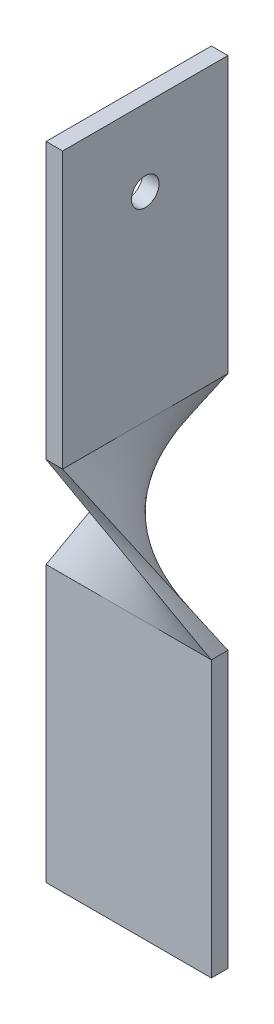
ISO-10303-21;
HEADER;
FILE_DESCRIPTION(('STEP AP214'),'2;1');
FILE_NAME('part.step','',(''),(''),'','','');
FILE_SCHEMA(('AUTOMOTIVE_DESIGN { 1 0 10303 214 1 1 1 1 }'));
ENDSEC;
DATA;
#1=APPLICATION_CONTEXT('core data for automotive mechanical design processes');
#2=APPLICATION_PROTOCOL_DEFINITION('international standard','automotive_design',2000,#1);
#3=PRODUCT_CONTEXT('',#1,'mechanical');
#4=PRODUCT('Part','Part','',(#3));
#5=PRODUCT_RELATED_PRODUCT_CATEGORY('part','',(#4));
#6=PRODUCT_DEFINITION_FORMATION('','',#4);
#7=PRODUCT_DEFINITION_CONTEXT('part definition',#1,'design');
#8=PRODUCT_DEFINITION('design','',#6,#7);
#9=PRODUCT_DEFINITION_SHAPE('','',#8);
#10=(LENGTH_UNIT() NAMED_UNIT(*) SI_UNIT(.MILLI.,.METRE.));
#11=(NAMED_UNIT(*) PLANE_ANGLE_UNIT() SI_UNIT($,.RADIAN.));
#12=(NAMED_UNIT(*) SI_UNIT($,.STERADIAN.) SOLID_ANGLE_UNIT());
#13=UNCERTAINTY_MEASURE_WITH_UNIT(LENGTH_MEASURE(1.E-05),#10,'distance_accuracy_value','');
#14=(GEOMETRIC_REPRESENTATION_CONTEXT(3) GLOBAL_UNCERTAINTY_ASSIGNED_CONTEXT((#13)) GLOBAL_UNIT_ASSIGNED_CONTEXT((#10,
#11,#12)) REPRESENTATION_CONTEXT('',''));
#15=CARTESIAN_POINT('',(0.,0.,0.));
#16=DIRECTION('',(0.,0.,1.));
#17=DIRECTION('',(1.,0.,0.));
#18=AXIS2_PLACEMENT_3D('',#15,#16,#17);
#19=CARTESIAN_POINT('',(0.,50.,0.));
#20=DIRECTION('',(1.,0.,0.));
#21=DIRECTION('',(0.,0.,-1.));
#22=AXIS2_PLACEMENT_3D('',#19,#20,#21);
#23=PLANE('',#22);
#24=DIRECTION('',(0.,0.,1.));
#25=VECTOR('',#24,1.);
#26=CARTESIAN_POINT('',(0.,0.,0.));
#27=LINE('',#26,#25);
#28=CARTESIAN_POINT('',(0.,0.,-3.));
#29=VERTEX_POINT('',#28);
#30=CARTESIAN_POINT('',(0.,0.,0.));
#31=VERTEX_POINT('',#30);
#32=EDGE_CURVE('E241',#29,#31,#27,.T.);
#33=ORIENTED_EDGE('',*,*,#32,.T.);
#34=DIRECTION('',(0.,-1.,0.));
#35=VECTOR('',#34,1.);
#36=CARTESIAN_POINT('',(0.,50.,0.));
#37=LINE('',#36,#35);
#38=CARTESIAN_POINT('',(0.,50.,0.));
#39=VERTEX_POINT('',#38);
#40=EDGE_CURVE('E12',#39,#31,#37,.T.);
#41=ORIENTED_EDGE('',*,*,#40,.F.);
#42=DIRECTION('',(0.,0.,-1.));
#43=VECTOR('',#42,1.);
#44=CARTESIAN_POINT('',(0.,50.,0.));
#45=LINE('',#44,#43);
#46=CARTESIAN_POINT('',(0.,50.,-3.));
#47=VERTEX_POINT('',#46);
#48=EDGE_CURVE('E311',#47,#39,#45,.F.);
#49=ORIENTED_EDGE('',*,*,#48,.F.);
#50=DIRECTION('',(0.,-1.,0.));
#51=VECTOR('',#50,1.);
#52=CARTESIAN_POINT('',(0.,50.,-3.));
#53=LINE('',#52,#51);
#54=EDGE_CURVE('E314',#47,#29,#53,.T.);
#55=ORIENTED_EDGE('',*,*,#54,.T.);
#56=EDGE_LOOP('',(#33,#41,#49,#55));
#57=FACE_BOUND('',#56,.T.);
#58=ADVANCED_FACE('F43',(#57),#23,.F.);
#59=CARTESIAN_POINT('',(0.,50.,0.));
#60=DIRECTION('',(0.,0.,-1.));
#61=DIRECTION('',(-1.,0.,0.));
#62=AXIS2_PLACEMENT_3D('',#59,#60,#61);
#63=PLANE('',#62);
#64=DIRECTION('',(1.,0.,0.));
#65=VECTOR('',#64,1.);
#66=CARTESIAN_POINT('',(0.,0.,0.));
#67=LINE('',#66,#65);
#68=CARTESIAN_POINT('',(30.,0.,0.));
#69=VERTEX_POINT('',#68);
#70=EDGE_CURVE('E300',#31,#69,#67,.T.);
#71=ORIENTED_EDGE('',*,*,#70,.T.);
#72=DIRECTION('',(0.,-1.,0.));
#73=VECTOR('',#72,1.);
#74=CARTESIAN_POINT('',(30.,50.,0.));
#75=LINE('',#74,#73);
#76=CARTESIAN_POINT('',(30.,50.,0.));
#77=VERTEX_POINT('',#76);
#78=EDGE_CURVE('E52',#77,#69,#75,.T.);
#79=ORIENTED_EDGE('',*,*,#78,.F.);
#80=DIRECTION('',(-1.,0.,0.));
#81=VECTOR('',#80,1.);
#82=CARTESIAN_POINT('',(0.,50.,0.));
#83=LINE('',#82,#81);
#84=EDGE_CURVE('E71',#39,#77,#83,.F.);
#85=ORIENTED_EDGE('',*,*,#84,.F.);
#86=ORIENTED_EDGE('',*,*,#40,.T.);
#87=EDGE_LOOP('',(#71,#79,#85,#86));
#88=FACE_BOUND('',#87,.T.);
#89=ADVANCED_FACE('F294',(#88),#63,.F.);
#90=CARTESIAN_POINT('',(30.,50.,0.));
#91=DIRECTION('',(-1.,0.,0.));
#92=DIRECTION('',(0.,0.,1.));
#93=AXIS2_PLACEMENT_3D('',#90,#91,#92);
#94=PLANE('',#93);
#95=DIRECTION('',(0.,0.,-1.));
#96=VECTOR('',#95,1.);
#97=CARTESIAN_POINT('',(30.,0.,0.));
#98=LINE('',#97,#96);
#99=CARTESIAN_POINT('',(30.,0.,-3.));
#100=VERTEX_POINT('',#99);
#101=EDGE_CURVE('E305',#69,#100,#98,.T.);
#102=ORIENTED_EDGE('',*,*,#101,.T.);
#103=DIRECTION('',(0.,-1.,0.));
#104=VECTOR('',#103,1.);
#105=CARTESIAN_POINT('',(30.,50.,-3.));
#106=LINE('',#105,#104);
#107=CARTESIAN_POINT('',(30.,50.,-3.));
#108=VERTEX_POINT('',#107);
#109=EDGE_CURVE('E60',#108,#100,#106,.T.);
#110=ORIENTED_EDGE('',*,*,#109,.F.);
#111=DIRECTION('',(0.,0.,1.));
#112=VECTOR('',#111,1.);
#113=CARTESIAN_POINT('',(30.,50.,0.));
#114=LINE('',#113,#112);
#115=EDGE_CURVE('E308',#77,#108,#114,.F.);
#116=ORIENTED_EDGE('',*,*,#115,.F.);
#117=ORIENTED_EDGE('',*,*,#78,.T.);
#118=EDGE_LOOP('',(#102,#110,#116,#117));
#119=FACE_BOUND('',#118,.T.);
#120=ADVANCED_FACE('F292',(#119),#94,.F.);
#121=CARTESIAN_POINT('',(0.,50.,-3.));
#122=DIRECTION('',(0.,0.,1.));
#123=DIRECTION('',(1.,0.,0.));
#124=AXIS2_PLACEMENT_3D('',#121,#122,#123);
#125=PLANE('',#124);
#126=DIRECTION('',(-1.,0.,0.));
#127=VECTOR('',#126,1.);
#128=CARTESIAN_POINT('',(0.,0.,-3.));
#129=LINE('',#128,#127);
#130=EDGE_CURVE('E78',#100,#29,#129,.T.);
#131=ORIENTED_EDGE('',*,*,#130,.T.);
#132=ORIENTED_EDGE('',*,*,#54,.F.);
#133=DIRECTION('',(1.,0.,0.));
#134=VECTOR('',#133,1.);
#135=CARTESIAN_POINT('',(0.,50.,-3.));
#136=LINE('',#135,#134);
#137=EDGE_CURVE('E316',#108,#47,#136,.F.);
#138=ORIENTED_EDGE('',*,*,#137,.F.);
#139=ORIENTED_EDGE('',*,*,#109,.T.);
#140=EDGE_LOOP('',(#131,#132,#138,#139));
#141=FACE_BOUND('',#140,.T.);
#142=ADVANCED_FACE('F288',(#141),#125,.F.);
#143=CARTESIAN_POINT('',(0.,0.,0.));
#144=DIRECTION('',(0.,-1.,0.));
#145=DIRECTION('',(0.,0.,-1.));
#146=AXIS2_PLACEMENT_3D('',#143,#144,#145);
#147=PLANE('',#146);
#148=ORIENTED_EDGE('',*,*,#32,.F.);
#149=ORIENTED_EDGE('',*,*,#130,.F.);
#150=ORIENTED_EDGE('',*,*,#101,.F.);
#151=ORIENTED_EDGE('',*,*,#70,.F.);
#152=EDGE_LOOP('',(#148,#149,#150,#151));
#153=FACE_BOUND('',#152,.T.);
#154=ADVANCED_FACE('F178',(#153),#147,.T.);
#155=CARTESIAN_POINT('',(0.,50.,-3.));
#156=CARTESIAN_POINT('',(16.5,80.,-16.5));
#157=CARTESIAN_POINT('',(0.,50.,-2.5));
#158=CARTESIAN_POINT('',(16.,80.,-16.5));
#159=CARTESIAN_POINT('',(0.,50.,-2.));
#160=CARTESIAN_POINT('',(15.5,80.,-16.5));
#161=CARTESIAN_POINT('',(0.,50.,-0.999999999999999));
#162=CARTESIAN_POINT('',(14.5,80.,-16.5));
#163=CARTESIAN_POINT('',(0.,50.,-0.5));
#164=CARTESIAN_POINT('',(14.,80.,-16.5));
#165=CARTESIAN_POINT('',(0.,50.,0.));
#166=CARTESIAN_POINT('',(13.5,80.,-16.5));
#167=B_SPLINE_SURFACE_WITH_KNOTS('',3,1,((#155,#156),(#157,#158),(#159,#160),(#161,#162),(#163,
#164),(#165,#166)),.UNSPECIFIED.,.F.,.F.,.F.,(4,2,4),(2,2),(0.,0.5,1.),(0.,1.),.UNSPECIFIED.);
#168=DIRECTION('',(0.36681261567265,0.815139145939222,-0.448326530266572));
#169=VECTOR('',#168,1.);
#170=CARTESIAN_POINT('',(6.75,65.,-8.25));
#171=LINE('',#170,#169);
#172=CARTESIAN_POINT('',(13.5,80.,-16.5));
#173=VERTEX_POINT('',#172);
#174=EDGE_CURVE('E143',#39,#173,#171,.T.);
#175=DIRECTION('',(-1.,0.,0.));
#176=VECTOR('',#175,1.);
#177=CARTESIAN_POINT('',(13.5,80.,-16.5));
#178=LINE('',#177,#176);
#179=CARTESIAN_POINT('',(16.5,80.,-16.5));
#180=VERTEX_POINT('',#179);
#181=EDGE_CURVE('E222',#180,#173,#178,.T.);
#182=DIRECTION('',(-0.448326530266572,-0.815139145939222,0.36681261567265));
#183=VECTOR('',#182,1.);
#184=CARTESIAN_POINT('',(8.25,65.,-9.75));
#185=LINE('',#184,#183);
#186=EDGE_CURVE('E140',#180,#47,#185,.T.);
#187=ORIENTED_EDGE('',*,*,#48,.T.);
#188=ORIENTED_EDGE('',*,*,#174,.T.);
#189=ORIENTED_EDGE('',*,*,#181,.F.);
#190=ORIENTED_EDGE('',*,*,#186,.T.);
#191=EDGE_LOOP('',(#187,#188,#189,#190));
#192=FACE_BOUND('',#191,.T.);
#193=ADVANCED_FACE('F171',(#192),#167,.T.);
#194=CARTESIAN_POINT('',(0.,50.,0.));
#195=CARTESIAN_POINT('',(13.5,80.,-16.5));
#196=CARTESIAN_POINT('',(5.,50.,0.));
#197=CARTESIAN_POINT('',(13.5,80.,-11.5));
#198=CARTESIAN_POINT('',(10.,50.,0.));
#199=CARTESIAN_POINT('',(13.5,80.,-6.50000000000002));
#200=CARTESIAN_POINT('',(20.,50.,0.));
#201=CARTESIAN_POINT('',(13.5,80.,3.49999999999998));
#202=CARTESIAN_POINT('',(25.,50.,0.));
#203=CARTESIAN_POINT('',(13.5,80.,8.49999999999999));
#204=CARTESIAN_POINT('',(30.,50.,0.));
#205=CARTESIAN_POINT('',(13.5,80.,13.5));
#206=B_SPLINE_SURFACE_WITH_KNOTS('',3,1,((#194,#195),(#196,#197),(#198,#199),(#200,#201),(#202,
#203),(#204,#205)),.UNSPECIFIED.,.F.,.F.,.F.,(4,2,4),(2,2),(0.,0.5,1.),(0.,1.),.UNSPECIFIED.);
#207=DIRECTION('',(-0.448326530266572,0.815139145939222,0.36681261567265));
#208=VECTOR('',#207,1.);
#209=CARTESIAN_POINT('',(21.75,65.,6.75));
#210=LINE('',#209,#208);
#211=CARTESIAN_POINT('',(13.5,80.,13.5));
#212=VERTEX_POINT('',#211);
#213=EDGE_CURVE('E252',#77,#212,#210,.T.);
#214=DIRECTION('',(0.,0.,1.));
#215=VECTOR('',#214,1.);
#216=CARTESIAN_POINT('',(13.5,80.,-16.5));
#217=LINE('',#216,#215);
#218=EDGE_CURVE('E138',#173,#212,#217,.T.);
#219=ORIENTED_EDGE('',*,*,#84,.T.);
#220=ORIENTED_EDGE('',*,*,#213,.T.);
#221=ORIENTED_EDGE('',*,*,#218,.F.);
#222=ORIENTED_EDGE('',*,*,#174,.F.);
#223=EDGE_LOOP('',(#219,#220,#221,#222));
#224=FACE_BOUND('',#223,.T.);
#225=ADVANCED_FACE('F177',(#224),#206,.T.);
#226=CARTESIAN_POINT('',(30.,50.,-3.));
#227=CARTESIAN_POINT('',(16.5,80.,13.5));
#228=CARTESIAN_POINT('',(25.,50.,-3.));
#229=CARTESIAN_POINT('',(16.5,80.,8.50000000000001));
#230=CARTESIAN_POINT('',(20.,50.,-3.));
#231=CARTESIAN_POINT('',(16.5,80.,3.50000000000002));
#232=CARTESIAN_POINT('',(10.,50.,-3.));
#233=CARTESIAN_POINT('',(16.5,80.,-6.49999999999998));
#234=CARTESIAN_POINT('',(5.00000000000001,50.,-3.));
#235=CARTESIAN_POINT('',(16.5,80.,-11.5));
#236=CARTESIAN_POINT('',(0.,50.,-3.));
#237=CARTESIAN_POINT('',(16.5,80.,-16.5));
#238=B_SPLINE_SURFACE_WITH_KNOTS('',3,1,((#226,#227),(#228,#229),(#230,#231),(#232,#233),(#234,
#235),(#236,#237)),.UNSPECIFIED.,.F.,.F.,.F.,(4,2,4),(2,2),(0.,0.5,1.),(0.,1.),.UNSPECIFIED.);
#239=DIRECTION('',(0.,0.,-1.));
#240=VECTOR('',#239,1.);
#241=CARTESIAN_POINT('',(16.5,80.,-16.5));
#242=LINE('',#241,#240);
#243=CARTESIAN_POINT('',(16.5,80.,13.5));
#244=VERTEX_POINT('',#243);
#245=EDGE_CURVE('E219',#244,#180,#242,.T.);
#246=DIRECTION('',(-0.36681261567265,0.815139145939222,0.448326530266572));
#247=VECTOR('',#246,1.);
#248=CARTESIAN_POINT('',(23.25,65.,5.25));
#249=LINE('',#248,#247);
#250=EDGE_CURVE('E250',#108,#244,#249,.T.);
#251=ORIENTED_EDGE('',*,*,#137,.T.);
#252=ORIENTED_EDGE('',*,*,#186,.F.);
#253=ORIENTED_EDGE('',*,*,#245,.F.);
#254=ORIENTED_EDGE('',*,*,#250,.F.);
#255=EDGE_LOOP('',(#251,#252,#253,#254));
#256=FACE_BOUND('',#255,.T.);
#257=ADVANCED_FACE('F277',(#256),#238,.T.);
#258=CARTESIAN_POINT('',(30.,50.,0.));
#259=CARTESIAN_POINT('',(13.5,80.,13.5));
#260=CARTESIAN_POINT('',(30.,50.,-0.499999999999996));
#261=CARTESIAN_POINT('',(14.,80.,13.5));
#262=CARTESIAN_POINT('',(30.,50.,-0.999999999999994));
#263=CARTESIAN_POINT('',(14.5,80.,13.5));
#264=CARTESIAN_POINT('',(30.,50.,-1.99999999999999));
#265=CARTESIAN_POINT('',(15.5,80.,13.5));
#266=CARTESIAN_POINT('',(30.,50.,-2.5));
#267=CARTESIAN_POINT('',(16.,80.,13.5));
#268=CARTESIAN_POINT('',(30.,50.,-3.));
#269=CARTESIAN_POINT('',(16.5,80.,13.5));
#270=B_SPLINE_SURFACE_WITH_KNOTS('',3,1,((#258,#259),(#260,#261),(#262,#263),(#264,#265),(#266,
#267),(#268,#269)),.UNSPECIFIED.,.F.,.F.,.F.,(4,2,4),(2,2),(0.,0.5,1.),(0.,1.),.UNSPECIFIED.);
#271=DIRECTION('',(1.,0.,0.));
#272=VECTOR('',#271,1.);
#273=CARTESIAN_POINT('',(13.5,80.,13.5));
#274=LINE('',#273,#272);
#275=EDGE_CURVE('E149',#212,#244,#274,.T.);
#276=ORIENTED_EDGE('',*,*,#115,.T.);
#277=ORIENTED_EDGE('',*,*,#250,.T.);
#278=ORIENTED_EDGE('',*,*,#275,.F.);
#279=ORIENTED_EDGE('',*,*,#213,.F.);
#280=EDGE_LOOP('',(#276,#277,#278,#279));
#281=FACE_BOUND('',#280,.T.);
#282=ADVANCED_FACE('F167',(#281),#270,.T.);
#283=CARTESIAN_POINT('',(13.5,130.,-16.5));
#284=DIRECTION('',(1.,0.,0.));
#285=DIRECTION('',(0.,0.,-1.));
#286=AXIS2_PLACEMENT_3D('',#283,#284,#285);
#287=PLANE('',#286);
#288=CARTESIAN_POINT('',(13.5,116.112068946705,-1.5));
#289=DIRECTION('',(-1.,0.,0.));
#290=DIRECTION('',(0.,0.,1.));
#291=AXIS2_PLACEMENT_3D('',#288,#289,#290);
#292=CIRCLE('',#291,2.5);
#293=CARTESIAN_POINT('',(13.5,116.112068946705,1.));
#294=VERTEX_POINT('',#293);
#295=EDGE_CURVE('E353',#294,#294,#292,.T.);
#296=ORIENTED_EDGE('',*,*,#295,.F.);
#297=EDGE_LOOP('',(#296));
#298=FACE_BOUND('',#297,.T.);
#299=ORIENTED_EDGE('',*,*,#218,.T.);
#300=DIRECTION('',(0.,-1.,0.));
#301=VECTOR('',#300,1.);
#302=CARTESIAN_POINT('',(13.5,130.,13.5));
#303=LINE('',#302,#301);
#304=CARTESIAN_POINT('',(13.5,130.,13.5));
#305=VERTEX_POINT('',#304);
#306=EDGE_CURVE('E119',#305,#212,#303,.T.);
#307=ORIENTED_EDGE('',*,*,#306,.F.);
#308=DIRECTION('',(0.,0.,1.));
#309=VECTOR('',#308,1.);
#310=CARTESIAN_POINT('',(13.5,130.,-16.5));
#311=LINE('',#310,#309);
#312=CARTESIAN_POINT('',(13.5,130.,-16.5));
#313=VERTEX_POINT('',#312);
#314=EDGE_CURVE('E126',#313,#305,#311,.T.);
#315=ORIENTED_EDGE('',*,*,#314,.F.);
#316=DIRECTION('',(0.,-1.,0.));
#317=VECTOR('',#316,1.);
#318=CARTESIAN_POINT('',(13.5,130.,-16.5));
#319=LINE('',#318,#317);
#320=EDGE_CURVE('E247',#313,#173,#319,.T.);
#321=ORIENTED_EDGE('',*,*,#320,.T.);
#322=EDGE_LOOP('',(#299,#307,#315,#321));
#323=FACE_BOUND('',#322,.T.);
#324=ADVANCED_FACE('F136',(#298,#323),#287,.F.);
#325=CARTESIAN_POINT('',(13.5,130.,13.5));
#326=DIRECTION('',(0.,0.,-1.));
#327=DIRECTION('',(-1.,0.,0.));
#328=AXIS2_PLACEMENT_3D('',#325,#326,#327);
#329=PLANE('',#328);
#330=ORIENTED_EDGE('',*,*,#275,.T.);
#331=DIRECTION('',(0.,-1.,0.));
#332=VECTOR('',#331,1.);
#333=CARTESIAN_POINT('',(16.5,130.,13.5));
#334=LINE('',#333,#332);
#335=CARTESIAN_POINT('',(16.5,130.,13.5));
#336=VERTEX_POINT('',#335);
#337=EDGE_CURVE('E122',#336,#244,#334,.T.);
#338=ORIENTED_EDGE('',*,*,#337,.F.);
#339=DIRECTION('',(1.,0.,0.));
#340=VECTOR('',#339,1.);
#341=CARTESIAN_POINT('',(13.5,130.,13.5));
#342=LINE('',#341,#340);
#343=EDGE_CURVE('E114',#305,#336,#342,.T.);
#344=ORIENTED_EDGE('',*,*,#343,.F.);
#345=ORIENTED_EDGE('',*,*,#306,.T.);
#346=EDGE_LOOP('',(#330,#338,#344,#345));
#347=FACE_BOUND('',#346,.T.);
#348=ADVANCED_FACE('F117',(#347),#329,.F.);
#349=CARTESIAN_POINT('',(16.5,130.,-16.5));
#350=DIRECTION('',(-1.,0.,0.));
#351=DIRECTION('',(0.,0.,1.));
#352=AXIS2_PLACEMENT_3D('',#349,#350,#351);
#353=PLANE('',#352);
#354=CARTESIAN_POINT('',(16.5,116.112068946705,-1.5));
#355=DIRECTION('',(-1.,0.,0.));
#356=DIRECTION('',(0.,0.,1.));
#357=AXIS2_PLACEMENT_3D('',#354,#355,#356);
#358=CIRCLE('',#357,2.5);
#359=CARTESIAN_POINT('',(16.5,116.112068946705,1.));
#360=VERTEX_POINT('',#359);
#361=EDGE_CURVE('E46',#360,#360,#358,.T.);
#362=ORIENTED_EDGE('',*,*,#361,.T.);
#363=EDGE_LOOP('',(#362));
#364=FACE_BOUND('',#363,.T.);
#365=ORIENTED_EDGE('',*,*,#245,.T.);
#366=DIRECTION('',(0.,-1.,0.));
#367=VECTOR('',#366,1.);
#368=CARTESIAN_POINT('',(16.5,130.,-16.5));
#369=LINE('',#368,#367);
#370=CARTESIAN_POINT('',(16.5,130.,-16.5));
#371=VERTEX_POINT('',#370);
#372=EDGE_CURVE('E145',#371,#180,#369,.T.);
#373=ORIENTED_EDGE('',*,*,#372,.F.);
#374=DIRECTION('',(0.,0.,-1.));
#375=VECTOR('',#374,1.);
#376=CARTESIAN_POINT('',(16.5,130.,-16.5));
#377=LINE('',#376,#375);
#378=EDGE_CURVE('E125',#336,#371,#377,.T.);
#379=ORIENTED_EDGE('',*,*,#378,.F.);
#380=ORIENTED_EDGE('',*,*,#337,.T.);
#381=EDGE_LOOP('',(#365,#373,#379,#380));
#382=FACE_BOUND('',#381,.T.);
#383=ADVANCED_FACE('F243',(#364,#382),#353,.F.);
#384=CARTESIAN_POINT('',(13.5,130.,-16.5));
#385=DIRECTION('',(0.,0.,1.));
#386=DIRECTION('',(1.,0.,0.));
#387=AXIS2_PLACEMENT_3D('',#384,#385,#386);
#388=PLANE('',#387);
#389=ORIENTED_EDGE('',*,*,#181,.T.);
#390=ORIENTED_EDGE('',*,*,#320,.F.);
#391=DIRECTION('',(-1.,0.,0.));
#392=VECTOR('',#391,1.);
#393=CARTESIAN_POINT('',(13.5,130.,-16.5));
#394=LINE('',#393,#392);
#395=EDGE_CURVE('E131',#371,#313,#394,.T.);
#396=ORIENTED_EDGE('',*,*,#395,.F.);
#397=ORIENTED_EDGE('',*,*,#372,.T.);
#398=EDGE_LOOP('',(#389,#390,#396,#397));
#399=FACE_BOUND('',#398,.T.);
#400=ADVANCED_FACE('F334',(#399),#388,.F.);
#401=CARTESIAN_POINT('',(0.,130.,0.));
#402=DIRECTION('',(0.,1.,0.));
#403=DIRECTION('',(0.,0.,1.));
#404=AXIS2_PLACEMENT_3D('',#401,#402,#403);
#405=PLANE('',#404);
#406=ORIENTED_EDGE('',*,*,#314,.T.);
#407=ORIENTED_EDGE('',*,*,#343,.T.);
#408=ORIENTED_EDGE('',*,*,#378,.T.);
#409=ORIENTED_EDGE('',*,*,#395,.T.);
#410=EDGE_LOOP('',(#406,#407,#408,#409));
#411=FACE_BOUND('',#410,.T.);
#412=ADVANCED_FACE('F129',(#411),#405,.T.);
#413=CARTESIAN_POINT('',(63.5,116.112068946705,-1.5));
#414=DIRECTION('',(-1.,0.,0.));
#415=DIRECTION('',(0.,0.,1.));
#416=AXIS2_PLACEMENT_3D('',#413,#414,#415);
#417=CYLINDRICAL_SURFACE('',#416,2.5);
#418=ORIENTED_EDGE('',*,*,#295,.T.);
#419=EDGE_LOOP('',(#418));
#420=FACE_BOUND('',#419,.T.);
#421=ORIENTED_EDGE('',*,*,#361,.F.);
#422=EDGE_LOOP('',(#421));
#423=FACE_BOUND('',#422,.T.);
#424=ADVANCED_FACE('F358',(#420,#423),#417,.F.);
#425=CLOSED_SHELL('',(#58,#89,#120,#142,#154,#193,#225,#257,#282,#324,#348,#383,#400,#412,#424));
#426=MANIFOLD_SOLID_BREP('B2',#425);
#427=ADVANCED_BREP_SHAPE_REPRESENTATION('',(#18,#426),#14);
#428=SHAPE_DEFINITION_REPRESENTATION(#9,#427);
ENDSEC;
END-ISO-10303-21;
